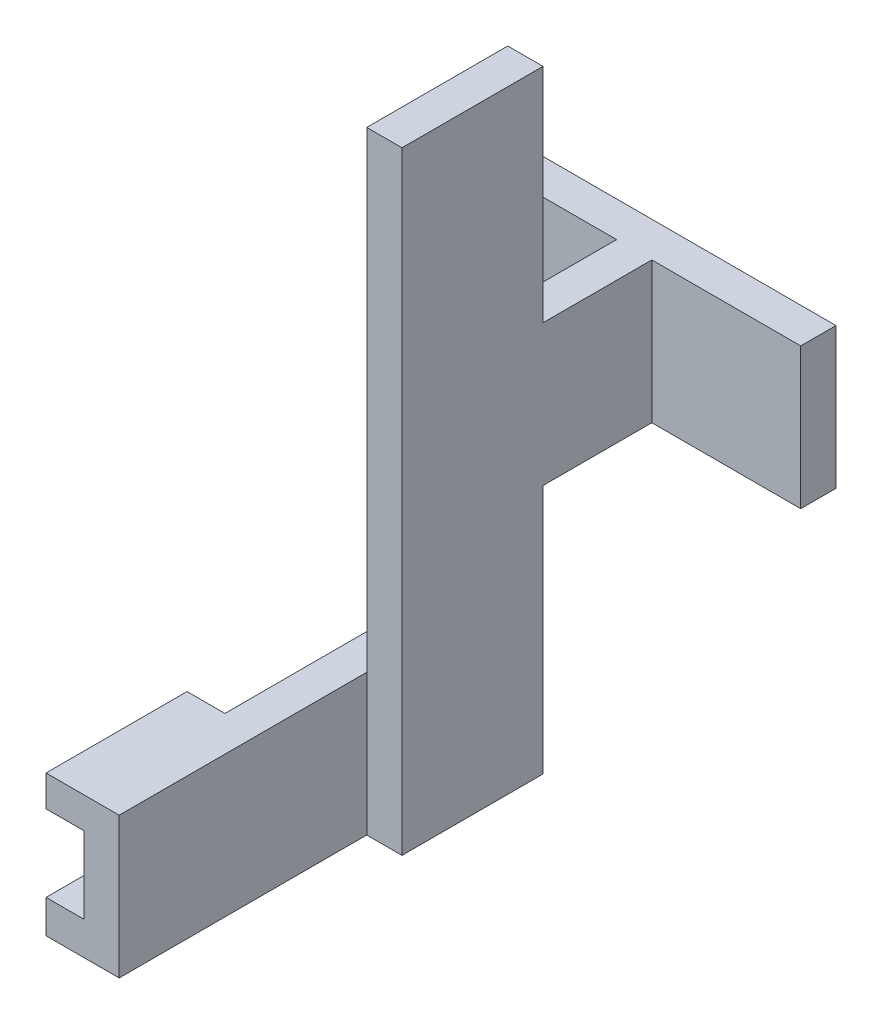
ISO-10303-21;
HEADER;
FILE_DESCRIPTION(('STEP AP214'),'2;1');
FILE_NAME('part.step','',(''),(''),'','','');
FILE_SCHEMA(('AUTOMOTIVE_DESIGN { 1 0 10303 214 1 1 1 1 }'));
ENDSEC;
DATA;
#1=APPLICATION_CONTEXT('core data for automotive mechanical design processes');
#2=APPLICATION_PROTOCOL_DEFINITION('international standard','automotive_design',2000,#1);
#3=PRODUCT_CONTEXT('',#1,'mechanical');
#4=PRODUCT('Part','Part','',(#3));
#5=PRODUCT_RELATED_PRODUCT_CATEGORY('part','',(#4));
#6=PRODUCT_DEFINITION_FORMATION('','',#4);
#7=PRODUCT_DEFINITION_CONTEXT('part definition',#1,'design');
#8=PRODUCT_DEFINITION('design','',#6,#7);
#9=PRODUCT_DEFINITION_SHAPE('','',#8);
#10=(LENGTH_UNIT() NAMED_UNIT(*) SI_UNIT(.MILLI.,.METRE.));
#11=(NAMED_UNIT(*) PLANE_ANGLE_UNIT() SI_UNIT($,.RADIAN.));
#12=(NAMED_UNIT(*) SI_UNIT($,.STERADIAN.) SOLID_ANGLE_UNIT());
#13=UNCERTAINTY_MEASURE_WITH_UNIT(LENGTH_MEASURE(1.E-05),#10,'distance_accuracy_value','');
#14=(GEOMETRIC_REPRESENTATION_CONTEXT(3) GLOBAL_UNCERTAINTY_ASSIGNED_CONTEXT((#13)) GLOBAL_UNIT_ASSIGNED_CONTEXT((#10,
#11,#12)) REPRESENTATION_CONTEXT('',''));
#15=CARTESIAN_POINT('',(0.,0.,0.));
#16=DIRECTION('',(0.,0.,1.));
#17=DIRECTION('',(1.,0.,0.));
#18=AXIS2_PLACEMENT_3D('',#15,#16,#17);
#19=CARTESIAN_POINT('',(60.,25.4,12.7));
#20=DIRECTION('',(0.,-1.,0.));
#21=DIRECTION('',(1.,0.,0.));
#22=AXIS2_PLACEMENT_3D('',#19,#20,#21);
#23=PLANE('',#22);
#24=DIRECTION('',(-1.,0.,0.));
#25=VECTOR('',#24,1.);
#26=CARTESIAN_POINT('',(-6.35000000000001,25.4,51.9));
#27=LINE('',#26,#25);
#28=CARTESIAN_POINT('',(6.35,25.4,51.9));
#29=VERTEX_POINT('',#28);
#30=CARTESIAN_POINT('',(-6.35000000000001,25.4,51.9));
#31=VERTEX_POINT('',#30);
#32=EDGE_CURVE('E48',#29,#31,#27,.T.);
#33=ORIENTED_EDGE('',*,*,#32,.F.);
#34=DIRECTION('',(0.,0.,-1.));
#35=VECTOR('',#34,1.);
#36=CARTESIAN_POINT('',(6.35,25.4,102.7));
#37=LINE('',#36,#35);
#38=CARTESIAN_POINT('',(6.35,25.4,12.7));
#39=VERTEX_POINT('',#38);
#40=EDGE_CURVE('E313',#29,#39,#37,.T.);
#41=ORIENTED_EDGE('',*,*,#40,.T.);
#42=DIRECTION('',(-1.,0.,0.));
#43=VECTOR('',#42,1.);
#44=CARTESIAN_POINT('',(60.,25.4,12.7));
#45=LINE('',#44,#43);
#46=CARTESIAN_POINT('',(60.,25.4,12.7));
#47=VERTEX_POINT('',#46);
#48=EDGE_CURVE('E331',#47,#39,#45,.T.);
#49=ORIENTED_EDGE('',*,*,#48,.F.);
#50=DIRECTION('',(0.,0.,-1.));
#51=VECTOR('',#50,1.);
#52=CARTESIAN_POINT('',(60.,25.4,12.7));
#53=LINE('',#52,#51);
#54=CARTESIAN_POINT('',(60.,25.4,0.));
#55=VERTEX_POINT('',#54);
#56=EDGE_CURVE('E344',#47,#55,#53,.T.);
#57=ORIENTED_EDGE('',*,*,#56,.T.);
#58=DIRECTION('',(-1.,0.,0.));
#59=VECTOR('',#58,1.);
#60=CARTESIAN_POINT('',(60.,25.4,0.));
#61=LINE('',#60,#59);
#62=CARTESIAN_POINT('',(-60.,25.4,0.));
#63=VERTEX_POINT('',#62);
#64=EDGE_CURVE('E324',#55,#63,#61,.T.);
#65=ORIENTED_EDGE('',*,*,#64,.T.);
#66=DIRECTION('',(0.,0.,-1.));
#67=VECTOR('',#66,1.);
#68=CARTESIAN_POINT('',(-60.,25.4,12.7));
#69=LINE('',#68,#67);
#70=CARTESIAN_POINT('',(-60.,25.4,12.7));
#71=VERTEX_POINT('',#70);
#72=EDGE_CURVE('E334',#71,#63,#69,.T.);
#73=ORIENTED_EDGE('',*,*,#72,.F.);
#74=CARTESIAN_POINT('',(-6.35,25.4,12.7));
#75=VERTEX_POINT('',#74);
#76=EDGE_CURVE('E330',#75,#71,#45,.T.);
#77=ORIENTED_EDGE('',*,*,#76,.F.);
#78=DIRECTION('',(0.,0.,-1.));
#79=VECTOR('',#78,1.);
#80=CARTESIAN_POINT('',(-6.35,25.4,102.7));
#81=LINE('',#80,#79);
#82=EDGE_CURVE('E307',#31,#75,#81,.T.);
#83=ORIENTED_EDGE('',*,*,#82,.F.);
#84=EDGE_LOOP('',(#33,#41,#49,#57,#65,#73,#77,#83));
#85=FACE_BOUND('',#84,.T.);
#86=ADVANCED_FACE('F33',(#85),#23,.F.);
#87=CARTESIAN_POINT('',(-19.05,0.,0.));
#88=DIRECTION('',(1.,0.,0.));
#89=DIRECTION('',(0.,0.,-1.));
#90=AXIS2_PLACEMENT_3D('',#87,#88,#89);
#91=PLANE('',#90);
#92=DIRECTION('',(0.,-1.,0.));
#93=VECTOR('',#92,1.);
#94=CARTESIAN_POINT('',(-19.05,-64.6,141.1));
#95=LINE('',#94,#93);
#96=CARTESIAN_POINT('',(-19.05,-64.6,141.1));
#97=VERTEX_POINT('',#96);
#98=CARTESIAN_POINT('',(-19.05,-75.7937597377267,141.1));
#99=VERTEX_POINT('',#98);
#100=EDGE_CURVE('E216',#97,#99,#95,.T.);
#101=ORIENTED_EDGE('',*,*,#100,.F.);
#102=DIRECTION('',(0.,0.,-1.));
#103=VECTOR('',#102,1.);
#104=CARTESIAN_POINT('',(-19.05,-64.6,51.9));
#105=LINE('',#104,#103);
#106=CARTESIAN_POINT('',(-19.05,-64.6,51.9));
#107=VERTEX_POINT('',#106);
#108=EDGE_CURVE('E271',#97,#107,#105,.T.);
#109=ORIENTED_EDGE('',*,*,#108,.T.);
#110=DIRECTION('',(0.,-1.,0.));
#111=VECTOR('',#110,1.);
#112=CARTESIAN_POINT('',(-19.05,-115.4,51.9));
#113=LINE('',#112,#111);
#114=CARTESIAN_POINT('',(-19.05,-115.4,51.9));
#115=VERTEX_POINT('',#114);
#116=EDGE_CURVE('E263',#107,#115,#113,.T.);
#117=ORIENTED_EDGE('',*,*,#116,.T.);
#118=DIRECTION('',(0.,0.,1.));
#119=VECTOR('',#118,1.);
#120=CARTESIAN_POINT('',(-19.05,-115.4,51.9));
#121=LINE('',#120,#119);
#122=CARTESIAN_POINT('',(-19.05,-115.4,141.1));
#123=VERTEX_POINT('',#122);
#124=EDGE_CURVE('E266',#115,#123,#121,.T.);
#125=ORIENTED_EDGE('',*,*,#124,.T.);
#126=DIRECTION('',(0.,-1.,0.));
#127=VECTOR('',#126,1.);
#128=CARTESIAN_POINT('',(-19.05,-115.4,141.1));
#129=LINE('',#128,#127);
#130=CARTESIAN_POINT('',(-19.05,-103.41943719791,141.1));
#131=VERTEX_POINT('',#130);
#132=EDGE_CURVE('E242',#131,#123,#129,.T.);
#133=ORIENTED_EDGE('',*,*,#132,.F.);
#134=DIRECTION('',(0.,0.,-1.));
#135=VECTOR('',#134,1.);
#136=CARTESIAN_POINT('',(-19.05,-103.41943719791,191.9));
#137=LINE('',#136,#135);
#138=CARTESIAN_POINT('',(-19.05,-103.41943719791,191.9));
#139=VERTEX_POINT('',#138);
#140=EDGE_CURVE('E237',#139,#131,#137,.T.);
#141=ORIENTED_EDGE('',*,*,#140,.F.);
#142=DIRECTION('',(0.,1.,0.));
#143=VECTOR('',#142,1.);
#144=CARTESIAN_POINT('',(-19.05,-115.4,191.9));
#145=LINE('',#144,#143);
#146=CARTESIAN_POINT('',(-19.05,-75.7937597377267,191.9));
#147=VERTEX_POINT('',#146);
#148=EDGE_CURVE('E269',#139,#147,#145,.T.);
#149=ORIENTED_EDGE('',*,*,#148,.T.);
#150=DIRECTION('',(0.,0.,1.));
#151=VECTOR('',#150,1.);
#152=CARTESIAN_POINT('',(-19.05,-75.7937597377267,191.9));
#153=LINE('',#152,#151);
#154=EDGE_CURVE('E56',#99,#147,#153,.T.);
#155=ORIENTED_EDGE('',*,*,#154,.F.);
#156=EDGE_LOOP('',(#101,#109,#117,#125,#133,#141,#149,#155));
#157=FACE_BOUND('',#156,.T.);
#158=ADVANCED_FACE('F388',(#157),#91,.F.);
#159=CARTESIAN_POINT('',(-6.35,-25.4,102.7));
#160=DIRECTION('',(1.,0.,0.));
#161=DIRECTION('',(0.,0.,-1.));
#162=AXIS2_PLACEMENT_3D('',#159,#160,#161);
#163=PLANE('',#162);
#164=DIRECTION('',(0.,0.,-1.));
#165=VECTOR('',#164,1.);
#166=CARTESIAN_POINT('',(-6.35,-64.6,51.9));
#167=LINE('',#166,#165);
#168=CARTESIAN_POINT('',(-6.35,-64.6,102.7));
#169=VERTEX_POINT('',#168);
#170=CARTESIAN_POINT('',(-6.35,-64.6,51.9));
#171=VERTEX_POINT('',#170);
#172=EDGE_CURVE('E188',#169,#171,#167,.T.);
#173=ORIENTED_EDGE('',*,*,#172,.F.);
#174=DIRECTION('',(0.,-1.,0.));
#175=VECTOR('',#174,1.);
#176=CARTESIAN_POINT('',(-6.35,-25.4,102.7));
#177=LINE('',#176,#175);
#178=CARTESIAN_POINT('',(-6.35000000000002,105.4,102.7));
#179=VERTEX_POINT('',#178);
#180=EDGE_CURVE('E181',#179,#169,#177,.T.);
#181=ORIENTED_EDGE('',*,*,#180,.F.);
#182=DIRECTION('',(0.,0.,1.));
#183=VECTOR('',#182,1.);
#184=CARTESIAN_POINT('',(-6.35000000000002,105.4,102.7));
#185=LINE('',#184,#183);
#186=CARTESIAN_POINT('',(-6.35000000000002,105.4,51.9));
#187=VERTEX_POINT('',#186);
#188=EDGE_CURVE('E186',#187,#179,#185,.T.);
#189=ORIENTED_EDGE('',*,*,#188,.F.);
#190=DIRECTION('',(0.,-1.,0.));
#191=VECTOR('',#190,1.);
#192=CARTESIAN_POINT('',(-6.35000000000002,105.4,51.9));
#193=LINE('',#192,#191);
#194=EDGE_CURVE('E210',#187,#31,#193,.T.);
#195=ORIENTED_EDGE('',*,*,#194,.T.);
#196=ORIENTED_EDGE('',*,*,#82,.T.);
#197=DIRECTION('',(0.,-1.,0.));
#198=VECTOR('',#197,1.);
#199=CARTESIAN_POINT('',(-6.35,-25.4,12.7));
#200=LINE('',#199,#198);
#201=CARTESIAN_POINT('',(-6.34999999999999,-25.4,12.7));
#202=VERTEX_POINT('',#201);
#203=EDGE_CURVE('E304',#75,#202,#200,.T.);
#204=ORIENTED_EDGE('',*,*,#203,.T.);
#205=DIRECTION('',(0.,0.,-1.));
#206=VECTOR('',#205,1.);
#207=CARTESIAN_POINT('',(-6.35,-25.4,102.7));
#208=LINE('',#207,#206);
#209=CARTESIAN_POINT('',(-6.35,-25.4,51.9));
#210=VERTEX_POINT('',#209);
#211=EDGE_CURVE('E317',#210,#202,#208,.T.);
#212=ORIENTED_EDGE('',*,*,#211,.F.);
#213=DIRECTION('',(0.,1.,0.));
#214=VECTOR('',#213,1.);
#215=CARTESIAN_POINT('',(-6.34999999999998,-115.4,51.9));
#216=LINE('',#215,#214);
#217=EDGE_CURVE('E303',#171,#210,#216,.T.);
#218=ORIENTED_EDGE('',*,*,#217,.F.);
#219=EDGE_LOOP('',(#173,#181,#189,#195,#196,#204,#212,#218));
#220=FACE_BOUND('',#219,.T.);
#221=ADVANCED_FACE('F183',(#220),#163,.F.);
#222=CARTESIAN_POINT('',(60.,-25.4,12.7));
#223=DIRECTION('',(0.,1.,0.));
#224=DIRECTION('',(-1.,0.,0.));
#225=AXIS2_PLACEMENT_3D('',#222,#223,#224);
#226=PLANE('',#225);
#227=DIRECTION('',(1.,0.,0.));
#228=VECTOR('',#227,1.);
#229=CARTESIAN_POINT('',(6.35000000000001,-25.4,51.9));
#230=LINE('',#229,#228);
#231=CARTESIAN_POINT('',(6.35000000000001,-25.4,51.9));
#232=VERTEX_POINT('',#231);
#233=EDGE_CURVE('E289',#210,#232,#230,.T.);
#234=ORIENTED_EDGE('',*,*,#233,.F.);
#235=ORIENTED_EDGE('',*,*,#211,.T.);
#236=DIRECTION('',(1.,0.,0.));
#237=VECTOR('',#236,1.);
#238=CARTESIAN_POINT('',(60.,-25.4,12.7));
#239=LINE('',#238,#237);
#240=CARTESIAN_POINT('',(-60.,-25.4,12.7));
#241=VERTEX_POINT('',#240);
#242=EDGE_CURVE('E325',#241,#202,#239,.T.);
#243=ORIENTED_EDGE('',*,*,#242,.F.);
#244=DIRECTION('',(0.,0.,-1.));
#245=VECTOR('',#244,1.);
#246=CARTESIAN_POINT('',(-60.,-25.4,12.7));
#247=LINE('',#246,#245);
#248=CARTESIAN_POINT('',(-60.,-25.4,0.));
#249=VERTEX_POINT('',#248);
#250=EDGE_CURVE('E11',#241,#249,#247,.T.);
#251=ORIENTED_EDGE('',*,*,#250,.T.);
#252=DIRECTION('',(1.,0.,0.));
#253=VECTOR('',#252,1.);
#254=CARTESIAN_POINT('',(60.,-25.4,0.));
#255=LINE('',#254,#253);
#256=CARTESIAN_POINT('',(60.,-25.4,0.));
#257=VERTEX_POINT('',#256);
#258=EDGE_CURVE('E337',#249,#257,#255,.T.);
#259=ORIENTED_EDGE('',*,*,#258,.T.);
#260=DIRECTION('',(0.,0.,-1.));
#261=VECTOR('',#260,1.);
#262=CARTESIAN_POINT('',(60.,-25.4,12.7));
#263=LINE('',#262,#261);
#264=CARTESIAN_POINT('',(60.,-25.4,12.7));
#265=VERTEX_POINT('',#264);
#266=EDGE_CURVE('E41',#265,#257,#263,.T.);
#267=ORIENTED_EDGE('',*,*,#266,.F.);
#268=CARTESIAN_POINT('',(6.35,-25.4,12.7));
#269=VERTEX_POINT('',#268);
#270=EDGE_CURVE('E323',#269,#265,#239,.T.);
#271=ORIENTED_EDGE('',*,*,#270,.F.);
#272=DIRECTION('',(0.,0.,-1.));
#273=VECTOR('',#272,1.);
#274=CARTESIAN_POINT('',(6.35,-25.4,102.7));
#275=LINE('',#274,#273);
#276=EDGE_CURVE('E315',#232,#269,#275,.T.);
#277=ORIENTED_EDGE('',*,*,#276,.F.);
#278=EDGE_LOOP('',(#234,#235,#243,#251,#259,#267,#271,#277));
#279=FACE_BOUND('',#278,.T.);
#280=ADVANCED_FACE('F377',(#279),#226,.F.);
#281=CARTESIAN_POINT('',(0.,0.,12.7));
#282=DIRECTION('',(0.,0.,1.));
#283=DIRECTION('',(1.,0.,0.));
#284=AXIS2_PLACEMENT_3D('',#281,#282,#283);
#285=PLANE('',#284);
#286=ORIENTED_EDGE('',*,*,#203,.F.);
#287=ORIENTED_EDGE('',*,*,#76,.T.);
#288=DIRECTION('',(0.,-1.,0.));
#289=VECTOR('',#288,1.);
#290=CARTESIAN_POINT('',(-60.,-25.4,12.7));
#291=LINE('',#290,#289);
#292=EDGE_CURVE('E320',#71,#241,#291,.T.);
#293=ORIENTED_EDGE('',*,*,#292,.T.);
#294=ORIENTED_EDGE('',*,*,#242,.T.);
#295=EDGE_LOOP('',(#286,#287,#293,#294));
#296=FACE_BOUND('',#295,.T.);
#297=ADVANCED_FACE('F367',(#296),#285,.T.);
#298=CARTESIAN_POINT('',(-60.,-25.4,12.7));
#299=DIRECTION('',(1.,0.,0.));
#300=DIRECTION('',(0.,0.,-1.));
#301=AXIS2_PLACEMENT_3D('',#298,#299,#300);
#302=PLANE('',#301);
#303=DIRECTION('',(0.,-1.,0.));
#304=VECTOR('',#303,1.);
#305=CARTESIAN_POINT('',(-60.,-25.4,0.));
#306=LINE('',#305,#304);
#307=EDGE_CURVE('E319',#63,#249,#306,.T.);
#308=ORIENTED_EDGE('',*,*,#307,.T.);
#309=ORIENTED_EDGE('',*,*,#250,.F.);
#310=ORIENTED_EDGE('',*,*,#292,.F.);
#311=ORIENTED_EDGE('',*,*,#72,.T.);
#312=EDGE_LOOP('',(#308,#309,#310,#311));
#313=FACE_BOUND('',#312,.T.);
#314=ADVANCED_FACE('F35',(#313),#302,.F.);
#315=CARTESIAN_POINT('',(60.,-25.4,12.7));
#316=DIRECTION('',(-1.,0.,0.));
#317=DIRECTION('',(0.,-1.,0.));
#318=AXIS2_PLACEMENT_3D('',#315,#316,#317);
#319=PLANE('',#318);
#320=DIRECTION('',(0.,1.,0.));
#321=VECTOR('',#320,1.);
#322=CARTESIAN_POINT('',(60.,-25.4,0.));
#323=LINE('',#322,#321);
#324=EDGE_CURVE('E339',#257,#55,#323,.T.);
#325=ORIENTED_EDGE('',*,*,#324,.T.);
#326=ORIENTED_EDGE('',*,*,#56,.F.);
#327=DIRECTION('',(0.,1.,0.));
#328=VECTOR('',#327,1.);
#329=CARTESIAN_POINT('',(60.,-25.4,12.7));
#330=LINE('',#329,#328);
#331=EDGE_CURVE('E328',#265,#47,#330,.T.);
#332=ORIENTED_EDGE('',*,*,#331,.F.);
#333=ORIENTED_EDGE('',*,*,#266,.T.);
#334=EDGE_LOOP('',(#325,#326,#332,#333));
#335=FACE_BOUND('',#334,.T.);
#336=ADVANCED_FACE('F351',(#335),#319,.F.);
#337=DIRECTION('',(0.,1.,0.));
#338=VECTOR('',#337,1.);
#339=CARTESIAN_POINT('',(6.35,-25.4,12.7));
#340=LINE('',#339,#338);
#341=EDGE_CURVE('E192',#269,#39,#340,.T.);
#342=ORIENTED_EDGE('',*,*,#341,.F.);
#343=ORIENTED_EDGE('',*,*,#270,.T.);
#344=ORIENTED_EDGE('',*,*,#331,.T.);
#345=ORIENTED_EDGE('',*,*,#48,.T.);
#346=EDGE_LOOP('',(#342,#343,#344,#345));
#347=FACE_BOUND('',#346,.T.);
#348=ADVANCED_FACE('F375',(#347),#285,.T.);
#349=CARTESIAN_POINT('',(0.,0.,0.));
#350=DIRECTION('',(0.,0.,1.));
#351=DIRECTION('',(1.,0.,0.));
#352=AXIS2_PLACEMENT_3D('',#349,#350,#351);
#353=PLANE('',#352);
#354=ORIENTED_EDGE('',*,*,#307,.F.);
#355=ORIENTED_EDGE('',*,*,#64,.F.);
#356=ORIENTED_EDGE('',*,*,#324,.F.);
#357=ORIENTED_EDGE('',*,*,#258,.F.);
#358=EDGE_LOOP('',(#354,#355,#356,#357));
#359=FACE_BOUND('',#358,.T.);
#360=ADVANCED_FACE('F358',(#359),#353,.F.);
#361=CARTESIAN_POINT('',(6.35,-25.4,102.7));
#362=DIRECTION('',(-1.,0.,0.));
#363=DIRECTION('',(0.,0.,1.));
#364=AXIS2_PLACEMENT_3D('',#361,#362,#363);
#365=PLANE('',#364);
#366=ORIENTED_EDGE('',*,*,#341,.T.);
#367=ORIENTED_EDGE('',*,*,#40,.F.);
#368=DIRECTION('',(0.,-1.,0.));
#369=VECTOR('',#368,1.);
#370=CARTESIAN_POINT('',(6.34999999999999,105.4,51.9));
#371=LINE('',#370,#369);
#372=CARTESIAN_POINT('',(6.34999999999999,105.4,51.9));
#373=VERTEX_POINT('',#372);
#374=EDGE_CURVE('E213',#373,#29,#371,.T.);
#375=ORIENTED_EDGE('',*,*,#374,.F.);
#376=DIRECTION('',(0.,0.,-1.));
#377=VECTOR('',#376,1.);
#378=CARTESIAN_POINT('',(6.34999999999999,105.4,102.7));
#379=LINE('',#378,#377);
#380=CARTESIAN_POINT('',(6.34999999999999,105.4,102.7));
#381=VERTEX_POINT('',#380);
#382=EDGE_CURVE('E200',#381,#373,#379,.T.);
#383=ORIENTED_EDGE('',*,*,#382,.F.);
#384=DIRECTION('',(0.,1.,0.));
#385=VECTOR('',#384,1.);
#386=CARTESIAN_POINT('',(6.35,-25.4,102.7));
#387=LINE('',#386,#385);
#388=CARTESIAN_POINT('',(6.35000000000001,-115.4,102.7));
#389=VERTEX_POINT('',#388);
#390=EDGE_CURVE('E191',#389,#381,#387,.T.);
#391=ORIENTED_EDGE('',*,*,#390,.F.);
#392=DIRECTION('',(0.,0.,1.));
#393=VECTOR('',#392,1.);
#394=CARTESIAN_POINT('',(6.35000000000001,-115.4,102.7));
#395=LINE('',#394,#393);
#396=CARTESIAN_POINT('',(6.35000000000002,-115.4,51.9));
#397=VERTEX_POINT('',#396);
#398=EDGE_CURVE('E290',#397,#389,#395,.T.);
#399=ORIENTED_EDGE('',*,*,#398,.F.);
#400=DIRECTION('',(0.,1.,0.));
#401=VECTOR('',#400,1.);
#402=CARTESIAN_POINT('',(6.35000000000002,-115.4,51.9));
#403=LINE('',#402,#401);
#404=EDGE_CURVE('E298',#397,#232,#403,.T.);
#405=ORIENTED_EDGE('',*,*,#404,.T.);
#406=ORIENTED_EDGE('',*,*,#276,.T.);
#407=EDGE_LOOP('',(#366,#367,#375,#383,#391,#399,#405,#406));
#408=FACE_BOUND('',#407,.T.);
#409=ADVANCED_FACE('F372',(#408),#365,.F.);
#410=CARTESIAN_POINT('',(0.,0.,102.7));
#411=DIRECTION('',(0.,0.,1.));
#412=DIRECTION('',(1.,0.,0.));
#413=AXIS2_PLACEMENT_3D('',#410,#411,#412);
#414=PLANE('',#413);
#415=ORIENTED_EDGE('',*,*,#180,.T.);
#416=DIRECTION('',(0.,1.,0.));
#417=VECTOR('',#416,1.);
#418=CARTESIAN_POINT('',(-6.35,0.,102.7));
#419=LINE('',#418,#417);
#420=CARTESIAN_POINT('',(-6.35,-115.4,102.7));
#421=VERTEX_POINT('',#420);
#422=EDGE_CURVE('E287',#421,#169,#419,.T.);
#423=ORIENTED_EDGE('',*,*,#422,.F.);
#424=DIRECTION('',(-1.,0.,0.));
#425=VECTOR('',#424,1.);
#426=CARTESIAN_POINT('',(6.35000000000001,-115.4,102.7));
#427=LINE('',#426,#425);
#428=EDGE_CURVE('E293',#389,#421,#427,.T.);
#429=ORIENTED_EDGE('',*,*,#428,.F.);
#430=ORIENTED_EDGE('',*,*,#390,.T.);
#431=DIRECTION('',(1.,0.,0.));
#432=VECTOR('',#431,1.);
#433=CARTESIAN_POINT('',(-6.35000000000002,105.4,102.7));
#434=LINE('',#433,#432);
#435=EDGE_CURVE('E195',#179,#381,#434,.T.);
#436=ORIENTED_EDGE('',*,*,#435,.F.);
#437=EDGE_LOOP('',(#415,#423,#429,#430,#436));
#438=FACE_BOUND('',#437,.T.);
#439=ADVANCED_FACE('F196',(#438),#414,.T.);
#440=CARTESIAN_POINT('',(6.35000000000002,-115.4,51.9));
#441=DIRECTION('',(0.,0.,1.));
#442=DIRECTION('',(1.,0.,0.));
#443=AXIS2_PLACEMENT_3D('',#440,#441,#442);
#444=PLANE('',#443);
#445=ORIENTED_EDGE('',*,*,#233,.T.);
#446=ORIENTED_EDGE('',*,*,#404,.F.);
#447=DIRECTION('',(1.,0.,0.));
#448=VECTOR('',#447,1.);
#449=CARTESIAN_POINT('',(6.35000000000002,-115.4,51.9));
#450=LINE('',#449,#448);
#451=EDGE_CURVE('E296',#115,#397,#450,.T.);
#452=ORIENTED_EDGE('',*,*,#451,.F.);
#453=ORIENTED_EDGE('',*,*,#116,.F.);
#454=DIRECTION('',(1.,0.,0.));
#455=VECTOR('',#454,1.);
#456=CARTESIAN_POINT('',(-19.05,-64.6,51.9));
#457=LINE('',#456,#455);
#458=EDGE_CURVE('E273',#107,#171,#457,.T.);
#459=ORIENTED_EDGE('',*,*,#458,.T.);
#460=ORIENTED_EDGE('',*,*,#217,.T.);
#461=EDGE_LOOP('',(#445,#446,#452,#453,#459,#460));
#462=FACE_BOUND('',#461,.T.);
#463=ADVANCED_FACE('F381',(#462),#444,.F.);
#464=CARTESIAN_POINT('',(0.,-115.4,0.));
#465=DIRECTION('',(0.,1.,0.));
#466=DIRECTION('',(0.,0.,1.));
#467=AXIS2_PLACEMENT_3D('',#464,#465,#466);
#468=PLANE('',#467);
#469=ORIENTED_EDGE('',*,*,#398,.T.);
#470=ORIENTED_EDGE('',*,*,#428,.T.);
#471=DIRECTION('',(0.,0.,1.));
#472=VECTOR('',#471,1.);
#473=CARTESIAN_POINT('',(-6.35,-115.4,51.9));
#474=LINE('',#473,#472);
#475=CARTESIAN_POINT('',(-6.35,-115.4,191.9));
#476=VERTEX_POINT('',#475);
#477=EDGE_CURVE('E262',#421,#476,#474,.T.);
#478=ORIENTED_EDGE('',*,*,#477,.T.);
#479=DIRECTION('',(1.,0.,0.));
#480=VECTOR('',#479,1.);
#481=CARTESIAN_POINT('',(-19.05,-115.4,191.9));
#482=LINE('',#481,#480);
#483=CARTESIAN_POINT('',(-32.7,-115.4,191.9));
#484=VERTEX_POINT('',#483);
#485=EDGE_CURVE('E284',#484,#476,#482,.T.);
#486=ORIENTED_EDGE('',*,*,#485,.F.);
#487=DIRECTION('',(0.,0.,1.));
#488=VECTOR('',#487,1.);
#489=CARTESIAN_POINT('',(-32.7,-115.4,191.9));
#490=LINE('',#489,#488);
#491=CARTESIAN_POINT('',(-32.7,-115.4,141.1));
#492=VERTEX_POINT('',#491);
#493=EDGE_CURVE('E246',#492,#484,#490,.T.);
#494=ORIENTED_EDGE('',*,*,#493,.F.);
#495=DIRECTION('',(1.,0.,0.));
#496=VECTOR('',#495,1.);
#497=CARTESIAN_POINT('',(-32.7,-115.4,141.1));
#498=LINE('',#497,#496);
#499=EDGE_CURVE('E249',#492,#123,#498,.T.);
#500=ORIENTED_EDGE('',*,*,#499,.T.);
#501=ORIENTED_EDGE('',*,*,#124,.F.);
#502=ORIENTED_EDGE('',*,*,#451,.T.);
#503=EDGE_LOOP('',(#469,#470,#478,#486,#494,#500,#501,#502));
#504=FACE_BOUND('',#503,.T.);
#505=ADVANCED_FACE('F384',(#504),#468,.F.);
#506=CARTESIAN_POINT('',(-19.05,-115.4,191.9));
#507=DIRECTION('',(0.,0.,-1.));
#508=DIRECTION('',(-1.,0.,0.));
#509=AXIS2_PLACEMENT_3D('',#506,#507,#508);
#510=PLANE('',#509);
#511=DIRECTION('',(0.,1.,0.));
#512=VECTOR('',#511,1.);
#513=CARTESIAN_POINT('',(-6.35,-115.4,191.9));
#514=LINE('',#513,#512);
#515=CARTESIAN_POINT('',(-6.35,-64.6,191.9));
#516=VERTEX_POINT('',#515);
#517=EDGE_CURVE('E275',#476,#516,#514,.T.);
#518=ORIENTED_EDGE('',*,*,#517,.T.);
#519=DIRECTION('',(1.,0.,0.));
#520=VECTOR('',#519,1.);
#521=CARTESIAN_POINT('',(-19.05,-64.6,191.9));
#522=LINE('',#521,#520);
#523=CARTESIAN_POINT('',(-32.7,-64.6,191.9));
#524=VERTEX_POINT('',#523);
#525=EDGE_CURVE('E281',#524,#516,#522,.T.);
#526=ORIENTED_EDGE('',*,*,#525,.F.);
#527=DIRECTION('',(0.,1.,0.));
#528=VECTOR('',#527,1.);
#529=CARTESIAN_POINT('',(-32.7,-64.6,191.9));
#530=LINE('',#529,#528);
#531=CARTESIAN_POINT('',(-32.7,-75.7937597377267,191.9));
#532=VERTEX_POINT('',#531);
#533=EDGE_CURVE('E217',#532,#524,#530,.T.);
#534=ORIENTED_EDGE('',*,*,#533,.F.);
#535=DIRECTION('',(1.,0.,0.));
#536=VECTOR('',#535,1.);
#537=CARTESIAN_POINT('',(-32.7,-75.7937597377267,191.9));
#538=LINE('',#537,#536);
#539=EDGE_CURVE('E226',#532,#147,#538,.T.);
#540=ORIENTED_EDGE('',*,*,#539,.T.);
#541=ORIENTED_EDGE('',*,*,#148,.F.);
#542=DIRECTION('',(1.,0.,0.));
#543=VECTOR('',#542,1.);
#544=CARTESIAN_POINT('',(-32.7,-103.41943719791,191.9));
#545=LINE('',#544,#543);
#546=CARTESIAN_POINT('',(-32.7,-103.41943719791,191.9));
#547=VERTEX_POINT('',#546);
#548=EDGE_CURVE('E259',#547,#139,#545,.T.);
#549=ORIENTED_EDGE('',*,*,#548,.F.);
#550=DIRECTION('',(0.,1.,0.));
#551=VECTOR('',#550,1.);
#552=CARTESIAN_POINT('',(-32.7,-115.4,191.9));
#553=LINE('',#552,#551);
#554=EDGE_CURVE('E238',#484,#547,#553,.T.);
#555=ORIENTED_EDGE('',*,*,#554,.F.);
#556=ORIENTED_EDGE('',*,*,#485,.T.);
#557=EDGE_LOOP('',(#518,#526,#534,#540,#541,#549,#555,#556));
#558=FACE_BOUND('',#557,.T.);
#559=ADVANCED_FACE('F400',(#558),#510,.F.);
#560=CARTESIAN_POINT('',(-19.05,-64.6,51.9));
#561=DIRECTION('',(0.,-1.,0.));
#562=DIRECTION('',(0.,0.,-1.));
#563=AXIS2_PLACEMENT_3D('',#560,#561,#562);
#564=PLANE('',#563);
#565=EDGE_CURVE('E267',#516,#169,#167,.T.);
#566=ORIENTED_EDGE('',*,*,#565,.T.);
#567=ORIENTED_EDGE('',*,*,#172,.T.);
#568=ORIENTED_EDGE('',*,*,#458,.F.);
#569=ORIENTED_EDGE('',*,*,#108,.F.);
#570=DIRECTION('',(1.,0.,0.));
#571=VECTOR('',#570,1.);
#572=CARTESIAN_POINT('',(-32.7,-64.6,141.1));
#573=LINE('',#572,#571);
#574=CARTESIAN_POINT('',(-32.7,-64.6,141.1));
#575=VERTEX_POINT('',#574);
#576=EDGE_CURVE('E234',#575,#97,#573,.T.);
#577=ORIENTED_EDGE('',*,*,#576,.F.);
#578=DIRECTION('',(0.,0.,-1.));
#579=VECTOR('',#578,1.);
#580=CARTESIAN_POINT('',(-32.7,-64.6,191.9));
#581=LINE('',#580,#579);
#582=EDGE_CURVE('E220',#524,#575,#581,.T.);
#583=ORIENTED_EDGE('',*,*,#582,.F.);
#584=ORIENTED_EDGE('',*,*,#525,.T.);
#585=EDGE_LOOP('',(#566,#567,#568,#569,#577,#583,#584));
#586=FACE_BOUND('',#585,.T.);
#587=ADVANCED_FACE('F391',(#586),#564,.F.);
#588=CARTESIAN_POINT('',(-6.35,0.,0.));
#589=DIRECTION('',(1.,0.,0.));
#590=DIRECTION('',(0.,0.,-1.));
#591=AXIS2_PLACEMENT_3D('',#588,#589,#590);
#592=PLANE('',#591);
#593=ORIENTED_EDGE('',*,*,#477,.F.);
#594=ORIENTED_EDGE('',*,*,#422,.T.);
#595=ORIENTED_EDGE('',*,*,#565,.F.);
#596=ORIENTED_EDGE('',*,*,#517,.F.);
#597=EDGE_LOOP('',(#593,#594,#595,#596));
#598=FACE_BOUND('',#597,.T.);
#599=ADVANCED_FACE('F396',(#598),#592,.T.);
#600=CARTESIAN_POINT('',(-32.7,-103.41943719791,191.9));
#601=DIRECTION('',(0.,-1.,0.));
#602=DIRECTION('',(0.,0.,-1.));
#603=AXIS2_PLACEMENT_3D('',#600,#601,#602);
#604=PLANE('',#603);
#605=ORIENTED_EDGE('',*,*,#140,.T.);
#606=DIRECTION('',(1.,0.,0.));
#607=VECTOR('',#606,1.);
#608=CARTESIAN_POINT('',(-32.7,-103.41943719791,141.1));
#609=LINE('',#608,#607);
#610=CARTESIAN_POINT('',(-32.7,-103.41943719791,141.1));
#611=VERTEX_POINT('',#610);
#612=EDGE_CURVE('E256',#611,#131,#609,.T.);
#613=ORIENTED_EDGE('',*,*,#612,.F.);
#614=DIRECTION('',(0.,0.,-1.));
#615=VECTOR('',#614,1.);
#616=CARTESIAN_POINT('',(-32.7,-103.41943719791,191.9));
#617=LINE('',#616,#615);
#618=EDGE_CURVE('E241',#547,#611,#617,.T.);
#619=ORIENTED_EDGE('',*,*,#618,.F.);
#620=ORIENTED_EDGE('',*,*,#548,.T.);
#621=EDGE_LOOP('',(#605,#613,#619,#620));
#622=FACE_BOUND('',#621,.T.);
#623=ADVANCED_FACE('F411',(#622),#604,.F.);
#624=CARTESIAN_POINT('',(-32.7,-115.4,141.1));
#625=DIRECTION('',(0.,0.,1.));
#626=DIRECTION('',(1.,0.,0.));
#627=AXIS2_PLACEMENT_3D('',#624,#625,#626);
#628=PLANE('',#627);
#629=ORIENTED_EDGE('',*,*,#132,.T.);
#630=ORIENTED_EDGE('',*,*,#499,.F.);
#631=DIRECTION('',(0.,-1.,0.));
#632=VECTOR('',#631,1.);
#633=CARTESIAN_POINT('',(-32.7,-115.4,141.1));
#634=LINE('',#633,#632);
#635=EDGE_CURVE('E244',#611,#492,#634,.T.);
#636=ORIENTED_EDGE('',*,*,#635,.F.);
#637=ORIENTED_EDGE('',*,*,#612,.T.);
#638=EDGE_LOOP('',(#629,#630,#636,#637));
#639=FACE_BOUND('',#638,.T.);
#640=ADVANCED_FACE('F409',(#639),#628,.F.);
#641=CARTESIAN_POINT('',(-32.7,0.,0.));
#642=DIRECTION('',(-1.,0.,0.));
#643=DIRECTION('',(0.,0.,1.));
#644=AXIS2_PLACEMENT_3D('',#641,#642,#643);
#645=PLANE('',#644);
#646=ORIENTED_EDGE('',*,*,#554,.T.);
#647=ORIENTED_EDGE('',*,*,#618,.T.);
#648=ORIENTED_EDGE('',*,*,#635,.T.);
#649=ORIENTED_EDGE('',*,*,#493,.T.);
#650=EDGE_LOOP('',(#646,#647,#648,#649));
#651=FACE_BOUND('',#650,.T.);
#652=ADVANCED_FACE('F404',(#651),#645,.T.);
#653=CARTESIAN_POINT('',(-32.7,-64.6,141.1));
#654=DIRECTION('',(0.,0.,1.));
#655=DIRECTION('',(1.,0.,0.));
#656=AXIS2_PLACEMENT_3D('',#653,#654,#655);
#657=PLANE('',#656);
#658=ORIENTED_EDGE('',*,*,#100,.T.);
#659=DIRECTION('',(1.,0.,0.));
#660=VECTOR('',#659,1.);
#661=CARTESIAN_POINT('',(-32.7,-75.7937597377267,141.1));
#662=LINE('',#661,#660);
#663=CARTESIAN_POINT('',(-32.7,-75.7937597377267,141.1));
#664=VERTEX_POINT('',#663);
#665=EDGE_CURVE('E231',#664,#99,#662,.T.);
#666=ORIENTED_EDGE('',*,*,#665,.F.);
#667=DIRECTION('',(0.,-1.,0.));
#668=VECTOR('',#667,1.);
#669=CARTESIAN_POINT('',(-32.7,-64.6,141.1));
#670=LINE('',#669,#668);
#671=EDGE_CURVE('E222',#575,#664,#670,.T.);
#672=ORIENTED_EDGE('',*,*,#671,.F.);
#673=ORIENTED_EDGE('',*,*,#576,.T.);
#674=EDGE_LOOP('',(#658,#666,#672,#673));
#675=FACE_BOUND('',#674,.T.);
#676=ADVANCED_FACE('F517',(#675),#657,.F.);
#677=CARTESIAN_POINT('',(-32.7,-75.7937597377267,191.9));
#678=DIRECTION('',(0.,1.,0.));
#679=DIRECTION('',(0.,0.,1.));
#680=AXIS2_PLACEMENT_3D('',#677,#678,#679);
#681=PLANE('',#680);
#682=ORIENTED_EDGE('',*,*,#154,.T.);
#683=ORIENTED_EDGE('',*,*,#539,.F.);
#684=DIRECTION('',(0.,0.,1.));
#685=VECTOR('',#684,1.);
#686=CARTESIAN_POINT('',(-32.7,-75.7937597377267,191.9));
#687=LINE('',#686,#685);
#688=EDGE_CURVE('E224',#664,#532,#687,.T.);
#689=ORIENTED_EDGE('',*,*,#688,.F.);
#690=ORIENTED_EDGE('',*,*,#665,.T.);
#691=EDGE_LOOP('',(#682,#683,#689,#690));
#692=FACE_BOUND('',#691,.T.);
#693=ADVANCED_FACE('F525',(#692),#681,.F.);
#694=CARTESIAN_POINT('',(-32.7,0.,0.));
#695=DIRECTION('',(1.,0.,0.));
#696=DIRECTION('',(0.,0.,-1.));
#697=AXIS2_PLACEMENT_3D('',#694,#695,#696);
#698=PLANE('',#697);
#699=ORIENTED_EDGE('',*,*,#533,.T.);
#700=ORIENTED_EDGE('',*,*,#582,.T.);
#701=ORIENTED_EDGE('',*,*,#671,.T.);
#702=ORIENTED_EDGE('',*,*,#688,.T.);
#703=EDGE_LOOP('',(#699,#700,#701,#702));
#704=FACE_BOUND('',#703,.T.);
#705=ADVANCED_FACE('F534',(#704),#698,.F.);
#706=CARTESIAN_POINT('',(-6.35000000000002,105.4,51.9));
#707=DIRECTION('',(0.,0.,1.));
#708=DIRECTION('',(1.,0.,0.));
#709=AXIS2_PLACEMENT_3D('',#706,#707,#708);
#710=PLANE('',#709);
#711=ORIENTED_EDGE('',*,*,#32,.T.);
#712=ORIENTED_EDGE('',*,*,#194,.F.);
#713=DIRECTION('',(-1.,0.,0.));
#714=VECTOR('',#713,1.);
#715=CARTESIAN_POINT('',(-6.35000000000002,105.4,51.9));
#716=LINE('',#715,#714);
#717=EDGE_CURVE('E204',#373,#187,#716,.T.);
#718=ORIENTED_EDGE('',*,*,#717,.F.);
#719=ORIENTED_EDGE('',*,*,#374,.T.);
#720=EDGE_LOOP('',(#711,#712,#718,#719));
#721=FACE_BOUND('',#720,.T.);
#722=ADVANCED_FACE('F369',(#721),#710,.F.);
#723=CARTESIAN_POINT('',(0.,105.4,0.));
#724=DIRECTION('',(0.,-1.,0.));
#725=DIRECTION('',(0.,0.,-1.));
#726=AXIS2_PLACEMENT_3D('',#723,#724,#725);
#727=PLANE('',#726);
#728=ORIENTED_EDGE('',*,*,#188,.T.);
#729=ORIENTED_EDGE('',*,*,#435,.T.);
#730=ORIENTED_EDGE('',*,*,#382,.T.);
#731=ORIENTED_EDGE('',*,*,#717,.T.);
#732=EDGE_LOOP('',(#728,#729,#730,#731));
#733=FACE_BOUND('',#732,.T.);
#734=ADVANCED_FACE('F202',(#733),#727,.F.);
#735=CLOSED_SHELL('',(#86,#158,#221,#280,#297,#314,#336,#348,#360,#409,#439,#463,#505,#559,#587,
#599,#623,#640,#652,#676,#693,#705,#722,#734));
#736=MANIFOLD_SOLID_BREP('B2',#735);
#737=ADVANCED_BREP_SHAPE_REPRESENTATION('',(#18,#736),#14);
#738=SHAPE_DEFINITION_REPRESENTATION(#9,#737);
ENDSEC;
END-ISO-10303-21;
